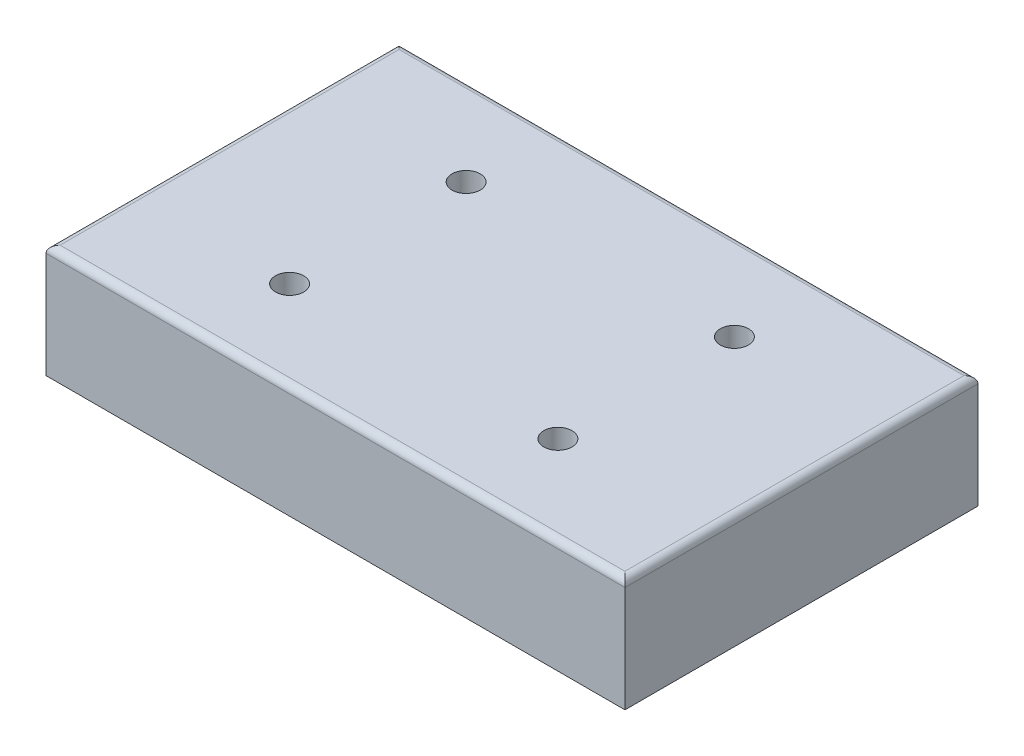
ISO-10303-21;
HEADER;
FILE_DESCRIPTION(('STEP AP214'),'2;1');
FILE_NAME('part.step','',(''),(''),'','','');
FILE_SCHEMA(('AUTOMOTIVE_DESIGN { 1 0 10303 214 1 1 1 1 }'));
ENDSEC;
DATA;
#1=APPLICATION_CONTEXT('core data for automotive mechanical design processes');
#2=APPLICATION_PROTOCOL_DEFINITION('international standard','automotive_design',2000,#1);
#3=PRODUCT_CONTEXT('',#1,'mechanical');
#4=PRODUCT('Part','Part','',(#3));
#5=PRODUCT_RELATED_PRODUCT_CATEGORY('part','',(#4));
#6=PRODUCT_DEFINITION_FORMATION('','',#4);
#7=PRODUCT_DEFINITION_CONTEXT('part definition',#1,'design');
#8=PRODUCT_DEFINITION('design','',#6,#7);
#9=PRODUCT_DEFINITION_SHAPE('','',#8);
#10=(LENGTH_UNIT() NAMED_UNIT(*) SI_UNIT(.MILLI.,.METRE.));
#11=(NAMED_UNIT(*) PLANE_ANGLE_UNIT() SI_UNIT($,.RADIAN.));
#12=(NAMED_UNIT(*) SI_UNIT($,.STERADIAN.) SOLID_ANGLE_UNIT());
#13=UNCERTAINTY_MEASURE_WITH_UNIT(LENGTH_MEASURE(1.E-05),#10,'distance_accuracy_value','');
#14=(GEOMETRIC_REPRESENTATION_CONTEXT(3) GLOBAL_UNCERTAINTY_ASSIGNED_CONTEXT((#13)) GLOBAL_UNIT_ASSIGNED_CONTEXT((#10,
#11,#12)) REPRESENTATION_CONTEXT('',''));
#15=CARTESIAN_POINT('',(0.,0.,0.));
#16=DIRECTION('',(0.,0.,1.));
#17=DIRECTION('',(1.,0.,0.));
#18=AXIS2_PLACEMENT_3D('',#15,#16,#17);
#19=CARTESIAN_POINT('',(41.,16.,-25.));
#20=DIRECTION('',(-1.,0.,0.));
#21=DIRECTION('',(0.,0.,1.));
#22=AXIS2_PLACEMENT_3D('',#19,#20,#21);
#23=PLANE('',#22);
#24=DIRECTION('',(0.,-1.,0.));
#25=VECTOR('',#24,1.);
#26=CARTESIAN_POINT('',(41.,16.,-25.));
#27=LINE('',#26,#25);
#28=CARTESIAN_POINT('',(41.,15.,-25.));
#29=VERTEX_POINT('',#28);
#30=CARTESIAN_POINT('',(41.,0.,-25.));
#31=VERTEX_POINT('',#30);
#32=EDGE_CURVE('E154',#29,#31,#27,.T.);
#33=ORIENTED_EDGE('',*,*,#32,.F.);
#34=DIRECTION('',(0.,0.,-1.));
#35=VECTOR('',#34,1.);
#36=CARTESIAN_POINT('',(41.,15.,25.));
#37=LINE('',#36,#35);
#38=CARTESIAN_POINT('',(41.,15.,25.));
#39=VERTEX_POINT('',#38);
#40=EDGE_CURVE('E168',#29,#39,#37,.F.);
#41=ORIENTED_EDGE('',*,*,#40,.T.);
#42=DIRECTION('',(0.,-1.,0.));
#43=VECTOR('',#42,1.);
#44=CARTESIAN_POINT('',(41.,16.,25.));
#45=LINE('',#44,#43);
#46=CARTESIAN_POINT('',(41.,0.,25.));
#47=VERTEX_POINT('',#46);
#48=EDGE_CURVE('E148',#39,#47,#45,.T.);
#49=ORIENTED_EDGE('',*,*,#48,.T.);
#50=DIRECTION('',(0.,0.,-1.));
#51=VECTOR('',#50,1.);
#52=CARTESIAN_POINT('',(41.,0.,-25.));
#53=LINE('',#52,#51);
#54=EDGE_CURVE('E136',#47,#31,#53,.T.);
#55=ORIENTED_EDGE('',*,*,#54,.T.);
#56=EDGE_LOOP('',(#33,#41,#49,#55));
#57=FACE_BOUND('',#56,.T.);
#58=ADVANCED_FACE('F39',(#57),#23,.F.);
#59=CARTESIAN_POINT('',(-41.,16.,-25.));
#60=DIRECTION('',(0.,0.,1.));
#61=DIRECTION('',(1.,0.,0.));
#62=AXIS2_PLACEMENT_3D('',#59,#60,#61);
#63=PLANE('',#62);
#64=DIRECTION('',(0.,-1.,0.));
#65=VECTOR('',#64,1.);
#66=CARTESIAN_POINT('',(-41.,16.,-25.));
#67=LINE('',#66,#65);
#68=CARTESIAN_POINT('',(-41.,15.,-25.));
#69=VERTEX_POINT('',#68);
#70=CARTESIAN_POINT('',(-41.,0.,-25.));
#71=VERTEX_POINT('',#70);
#72=EDGE_CURVE('E152',#69,#71,#67,.T.);
#73=ORIENTED_EDGE('',*,*,#72,.F.);
#74=DIRECTION('',(-1.,0.,0.));
#75=VECTOR('',#74,1.);
#76=CARTESIAN_POINT('',(41.,15.,-25.));
#77=LINE('',#76,#75);
#78=EDGE_CURVE('E48',#69,#29,#77,.F.);
#79=ORIENTED_EDGE('',*,*,#78,.T.);
#80=ORIENTED_EDGE('',*,*,#32,.T.);
#81=DIRECTION('',(-1.,0.,0.));
#82=VECTOR('',#81,1.);
#83=CARTESIAN_POINT('',(-41.,0.,-25.));
#84=LINE('',#83,#82);
#85=EDGE_CURVE('E139',#31,#71,#84,.T.);
#86=ORIENTED_EDGE('',*,*,#85,.T.);
#87=EDGE_LOOP('',(#73,#79,#80,#86));
#88=FACE_BOUND('',#87,.T.);
#89=ADVANCED_FACE('F217',(#88),#63,.F.);
#90=CARTESIAN_POINT('',(-41.,16.,-25.));
#91=DIRECTION('',(1.,0.,0.));
#92=DIRECTION('',(0.,0.,-1.));
#93=AXIS2_PLACEMENT_3D('',#90,#91,#92);
#94=PLANE('',#93);
#95=DIRECTION('',(0.,-1.,0.));
#96=VECTOR('',#95,1.);
#97=CARTESIAN_POINT('',(-41.,16.,25.));
#98=LINE('',#97,#96);
#99=CARTESIAN_POINT('',(-41.,15.,25.));
#100=VERTEX_POINT('',#99);
#101=CARTESIAN_POINT('',(-41.,0.,25.));
#102=VERTEX_POINT('',#101);
#103=EDGE_CURVE('E150',#100,#102,#98,.T.);
#104=ORIENTED_EDGE('',*,*,#103,.F.);
#105=DIRECTION('',(0.,0.,1.));
#106=VECTOR('',#105,1.);
#107=CARTESIAN_POINT('',(-41.,15.,-25.));
#108=LINE('',#107,#106);
#109=EDGE_CURVE('E11',#100,#69,#108,.F.);
#110=ORIENTED_EDGE('',*,*,#109,.T.);
#111=ORIENTED_EDGE('',*,*,#72,.T.);
#112=DIRECTION('',(0.,0.,1.));
#113=VECTOR('',#112,1.);
#114=CARTESIAN_POINT('',(-41.,0.,-25.));
#115=LINE('',#114,#113);
#116=EDGE_CURVE('E142',#71,#102,#115,.T.);
#117=ORIENTED_EDGE('',*,*,#116,.T.);
#118=EDGE_LOOP('',(#104,#110,#111,#117));
#119=FACE_BOUND('',#118,.T.);
#120=ADVANCED_FACE('F211',(#119),#94,.F.);
#121=CARTESIAN_POINT('',(-41.,16.,25.));
#122=DIRECTION('',(0.,0.,-1.));
#123=DIRECTION('',(-1.,0.,0.));
#124=AXIS2_PLACEMENT_3D('',#121,#122,#123);
#125=PLANE('',#124);
#126=ORIENTED_EDGE('',*,*,#48,.F.);
#127=DIRECTION('',(1.,0.,0.));
#128=VECTOR('',#127,1.);
#129=CARTESIAN_POINT('',(-41.,15.,25.));
#130=LINE('',#129,#128);
#131=EDGE_CURVE('E165',#39,#100,#130,.F.);
#132=ORIENTED_EDGE('',*,*,#131,.T.);
#133=ORIENTED_EDGE('',*,*,#103,.T.);
#134=DIRECTION('',(1.,0.,0.));
#135=VECTOR('',#134,1.);
#136=CARTESIAN_POINT('',(-41.,0.,25.));
#137=LINE('',#136,#135);
#138=EDGE_CURVE('E145',#102,#47,#137,.T.);
#139=ORIENTED_EDGE('',*,*,#138,.T.);
#140=EDGE_LOOP('',(#126,#132,#133,#139));
#141=FACE_BOUND('',#140,.T.);
#142=ADVANCED_FACE('F193',(#141),#125,.F.);
#143=CARTESIAN_POINT('',(0.,16.,0.));
#144=DIRECTION('',(0.,1.,0.));
#145=DIRECTION('',(0.,0.,1.));
#146=AXIS2_PLACEMENT_3D('',#143,#144,#145);
#147=PLANE('',#146);
#148=CARTESIAN_POINT('',(-19.,16.,-12.5));
#149=DIRECTION('',(0.,1.,0.));
#150=DIRECTION('',(0.,0.,1.));
#151=AXIS2_PLACEMENT_3D('',#148,#149,#150);
#152=CIRCLE('',#151,1.99999999999999);
#153=CARTESIAN_POINT('',(-19.,16.,-10.5));
#154=VERTEX_POINT('',#153);
#155=EDGE_CURVE('E113',#154,#154,#152,.T.);
#156=ORIENTED_EDGE('',*,*,#155,.F.);
#157=EDGE_LOOP('',(#156));
#158=FACE_BOUND('',#157,.T.);
#159=CARTESIAN_POINT('',(19.,16.,-12.5));
#160=DIRECTION('',(0.,1.,0.));
#161=DIRECTION('',(0.,0.,1.));
#162=AXIS2_PLACEMENT_3D('',#159,#160,#161);
#163=CIRCLE('',#162,1.99999999999999);
#164=CARTESIAN_POINT('',(19.,16.,-10.5));
#165=VERTEX_POINT('',#164);
#166=EDGE_CURVE('E112',#165,#165,#163,.T.);
#167=ORIENTED_EDGE('',*,*,#166,.F.);
#168=EDGE_LOOP('',(#167));
#169=FACE_BOUND('',#168,.T.);
#170=CARTESIAN_POINT('',(19.,16.,12.5));
#171=DIRECTION('',(0.,1.,0.));
#172=DIRECTION('',(0.,0.,1.));
#173=AXIS2_PLACEMENT_3D('',#170,#171,#172);
#174=CIRCLE('',#173,1.99999999999999);
#175=CARTESIAN_POINT('',(19.,16.,14.5));
#176=VERTEX_POINT('',#175);
#177=EDGE_CURVE('E123',#176,#176,#174,.T.);
#178=ORIENTED_EDGE('',*,*,#177,.F.);
#179=EDGE_LOOP('',(#178));
#180=FACE_BOUND('',#179,.T.);
#181=CARTESIAN_POINT('',(-19.,16.,12.5));
#182=DIRECTION('',(0.,1.,0.));
#183=DIRECTION('',(0.,0.,1.));
#184=AXIS2_PLACEMENT_3D('',#181,#182,#183);
#185=CIRCLE('',#184,1.99999999999999);
#186=CARTESIAN_POINT('',(-19.,16.,14.5));
#187=VERTEX_POINT('',#186);
#188=EDGE_CURVE('E129',#187,#187,#185,.T.);
#189=ORIENTED_EDGE('',*,*,#188,.F.);
#190=EDGE_LOOP('',(#189));
#191=FACE_BOUND('',#190,.T.);
#192=DIRECTION('',(0.,0.,1.));
#193=VECTOR('',#192,1.);
#194=CARTESIAN_POINT('',(-40.,16.,25.));
#195=LINE('',#194,#193);
#196=CARTESIAN_POINT('',(-40.,16.,-24.));
#197=VERTEX_POINT('',#196);
#198=CARTESIAN_POINT('',(-40.,16.,24.));
#199=VERTEX_POINT('',#198);
#200=EDGE_CURVE('E156',#197,#199,#195,.T.);
#201=ORIENTED_EDGE('',*,*,#200,.T.);
#202=DIRECTION('',(1.,0.,0.));
#203=VECTOR('',#202,1.);
#204=CARTESIAN_POINT('',(41.,16.,24.));
#205=LINE('',#204,#203);
#206=CARTESIAN_POINT('',(40.,16.,24.));
#207=VERTEX_POINT('',#206);
#208=EDGE_CURVE('E162',#199,#207,#205,.T.);
#209=ORIENTED_EDGE('',*,*,#208,.T.);
#210=DIRECTION('',(0.,0.,-1.));
#211=VECTOR('',#210,1.);
#212=CARTESIAN_POINT('',(40.,16.,-25.));
#213=LINE('',#212,#211);
#214=CARTESIAN_POINT('',(40.,16.,-24.));
#215=VERTEX_POINT('',#214);
#216=EDGE_CURVE('E160',#207,#215,#213,.T.);
#217=ORIENTED_EDGE('',*,*,#216,.T.);
#218=DIRECTION('',(-1.,0.,0.));
#219=VECTOR('',#218,1.);
#220=CARTESIAN_POINT('',(-41.,16.,-24.));
#221=LINE('',#220,#219);
#222=EDGE_CURVE('E158',#215,#197,#221,.T.);
#223=ORIENTED_EDGE('',*,*,#222,.T.);
#224=EDGE_LOOP('',(#201,#209,#217,#223));
#225=FACE_BOUND('',#224,.T.);
#226=ADVANCED_FACE('F200',(#158,#169,#180,#191,#225),#147,.T.);
#227=CARTESIAN_POINT('',(0.,0.,0.));
#228=DIRECTION('',(0.,1.,0.));
#229=DIRECTION('',(0.,0.,1.));
#230=AXIS2_PLACEMENT_3D('',#227,#228,#229);
#231=PLANE('',#230);
#232=ORIENTED_EDGE('',*,*,#54,.F.);
#233=ORIENTED_EDGE('',*,*,#138,.F.);
#234=ORIENTED_EDGE('',*,*,#116,.F.);
#235=ORIENTED_EDGE('',*,*,#85,.F.);
#236=EDGE_LOOP('',(#232,#233,#234,#235));
#237=FACE_BOUND('',#236,.T.);
#238=ADVANCED_FACE('F202',(#237),#231,.F.);
#239=CARTESIAN_POINT('',(0.,15.,-24.));
#240=DIRECTION('',(1.,0.,0.));
#241=DIRECTION('',(0.,0.,-1.));
#242=AXIS2_PLACEMENT_3D('',#239,#240,#241);
#243=CYLINDRICAL_SURFACE('',#242,1.);
#244=CARTESIAN_POINT('',(40.,15.,-24.));
#245=DIRECTION('',(0.707106781186548,0.,0.707106781186547));
#246=DIRECTION('',(0.707106781186547,0.,-0.707106781186548));
#247=AXIS2_PLACEMENT_3D('',#244,#245,#246);
#248=ELLIPSE('',#247,1.41421356237309,1.);
#249=EDGE_CURVE('E173',#29,#215,#248,.T.);
#250=ORIENTED_EDGE('',*,*,#249,.F.);
#251=ORIENTED_EDGE('',*,*,#78,.F.);
#252=CARTESIAN_POINT('',(-40.,15.,-24.));
#253=DIRECTION('',(0.707106781186547,0.,-0.707106781186548));
#254=DIRECTION('',(-0.707106781186548,0.,-0.707106781186547));
#255=AXIS2_PLACEMENT_3D('',#252,#253,#254);
#256=ELLIPSE('',#255,1.4142135623731,1.);
#257=EDGE_CURVE('E43',#197,#69,#256,.F.);
#258=ORIENTED_EDGE('',*,*,#257,.F.);
#259=ORIENTED_EDGE('',*,*,#222,.F.);
#260=EDGE_LOOP('',(#250,#251,#258,#259));
#261=FACE_BOUND('',#260,.T.);
#262=ADVANCED_FACE('F41',(#261),#243,.T.);
#263=CARTESIAN_POINT('',(-40.,15.,0.));
#264=DIRECTION('',(0.,0.,-1.));
#265=DIRECTION('',(-1.,0.,0.));
#266=AXIS2_PLACEMENT_3D('',#263,#264,#265);
#267=CYLINDRICAL_SURFACE('',#266,1.);
#268=ORIENTED_EDGE('',*,*,#257,.T.);
#269=ORIENTED_EDGE('',*,*,#109,.F.);
#270=CARTESIAN_POINT('',(-40.,15.,24.));
#271=DIRECTION('',(-0.707106781186548,0.,-0.707106781186547));
#272=DIRECTION('',(0.707106781186547,0.,-0.707106781186548));
#273=AXIS2_PLACEMENT_3D('',#270,#271,#272);
#274=ELLIPSE('',#273,1.41421356237309,1.);
#275=EDGE_CURVE('E172',#199,#100,#274,.F.);
#276=ORIENTED_EDGE('',*,*,#275,.F.);
#277=ORIENTED_EDGE('',*,*,#200,.F.);
#278=EDGE_LOOP('',(#268,#269,#276,#277));
#279=FACE_BOUND('',#278,.T.);
#280=ADVANCED_FACE('F183',(#279),#267,.T.);
#281=CARTESIAN_POINT('',(40.,15.,0.));
#282=DIRECTION('',(0.,0.,1.));
#283=DIRECTION('',(1.,0.,0.));
#284=AXIS2_PLACEMENT_3D('',#281,#282,#283);
#285=CYLINDRICAL_SURFACE('',#284,1.);
#286=ORIENTED_EDGE('',*,*,#249,.T.);
#287=ORIENTED_EDGE('',*,*,#216,.F.);
#288=CARTESIAN_POINT('',(40.,15.,24.));
#289=DIRECTION('',(-0.707106781186547,0.,0.707106781186548));
#290=DIRECTION('',(0.707106781186548,0.,0.707106781186547));
#291=AXIS2_PLACEMENT_3D('',#288,#289,#290);
#292=ELLIPSE('',#291,1.4142135623731,1.);
#293=EDGE_CURVE('E135',#39,#207,#292,.T.);
#294=ORIENTED_EDGE('',*,*,#293,.F.);
#295=ORIENTED_EDGE('',*,*,#40,.F.);
#296=EDGE_LOOP('',(#286,#287,#294,#295));
#297=FACE_BOUND('',#296,.T.);
#298=ADVANCED_FACE('F188',(#297),#285,.T.);
#299=CARTESIAN_POINT('',(0.,15.,24.));
#300=DIRECTION('',(-1.,0.,0.));
#301=DIRECTION('',(0.,0.,1.));
#302=AXIS2_PLACEMENT_3D('',#299,#300,#301);
#303=CYLINDRICAL_SURFACE('',#302,1.);
#304=ORIENTED_EDGE('',*,*,#275,.T.);
#305=ORIENTED_EDGE('',*,*,#131,.F.);
#306=ORIENTED_EDGE('',*,*,#293,.T.);
#307=ORIENTED_EDGE('',*,*,#208,.F.);
#308=EDGE_LOOP('',(#304,#305,#306,#307));
#309=FACE_BOUND('',#308,.T.);
#310=ADVANCED_FACE('F197',(#309),#303,.T.);
#311=CARTESIAN_POINT('',(-19.,9.20172123805512,12.5));
#312=DIRECTION('',(0.,1.,0.));
#313=DIRECTION('',(0.,0.,1.));
#314=AXIS2_PLACEMENT_3D('',#311,#312,#313);
#315=CONICAL_SURFACE('',#314,2.,1.02974425867665);
#316=CARTESIAN_POINT('',(-19.,8.,12.5));
#317=VERTEX_POINT('',#316);
#318=VERTEX_LOOP('',#317);
#319=FACE_BOUND('',#318,.T.);
#320=CARTESIAN_POINT('',(-19.,9.20172123805512,12.5));
#321=DIRECTION('',(0.,1.,0.));
#322=DIRECTION('',(0.,0.,1.));
#323=AXIS2_PLACEMENT_3D('',#320,#321,#322);
#324=CIRCLE('',#323,2.);
#325=CARTESIAN_POINT('',(-19.,9.20172123805512,14.5));
#326=VERTEX_POINT('',#325);
#327=EDGE_CURVE('E132',#326,#326,#324,.T.);
#328=ORIENTED_EDGE('',*,*,#327,.T.);
#329=EDGE_LOOP('',(#328));
#330=FACE_BOUND('',#329,.T.);
#331=ADVANCED_FACE('F227',(#319,#330),#315,.F.);
#332=CARTESIAN_POINT('',(-19.,16.,12.5));
#333=DIRECTION('',(0.,1.,0.));
#334=DIRECTION('',(0.,0.,1.));
#335=AXIS2_PLACEMENT_3D('',#332,#333,#334);
#336=CYLINDRICAL_SURFACE('',#335,1.99999999999999);
#337=ORIENTED_EDGE('',*,*,#327,.F.);
#338=EDGE_LOOP('',(#337));
#339=FACE_BOUND('',#338,.T.);
#340=ORIENTED_EDGE('',*,*,#188,.T.);
#341=EDGE_LOOP('',(#340));
#342=FACE_BOUND('',#341,.T.);
#343=ADVANCED_FACE('F287',(#339,#342),#336,.F.);
#344=CARTESIAN_POINT('',(19.,9.20172123805512,12.5));
#345=DIRECTION('',(0.,1.,0.));
#346=DIRECTION('',(0.,0.,1.));
#347=AXIS2_PLACEMENT_3D('',#344,#345,#346);
#348=CONICAL_SURFACE('',#347,2.,1.02974425867665);
#349=CARTESIAN_POINT('',(19.,8.,12.5));
#350=VERTEX_POINT('',#349);
#351=VERTEX_LOOP('',#350);
#352=FACE_BOUND('',#351,.T.);
#353=CARTESIAN_POINT('',(19.,9.20172123805512,12.5));
#354=DIRECTION('',(0.,1.,0.));
#355=DIRECTION('',(0.,0.,1.));
#356=AXIS2_PLACEMENT_3D('',#353,#354,#355);
#357=CIRCLE('',#356,2.);
#358=CARTESIAN_POINT('',(19.,9.20172123805512,14.5));
#359=VERTEX_POINT('',#358);
#360=EDGE_CURVE('E126',#359,#359,#357,.T.);
#361=ORIENTED_EDGE('',*,*,#360,.T.);
#362=EDGE_LOOP('',(#361));
#363=FACE_BOUND('',#362,.T.);
#364=ADVANCED_FACE('F297',(#352,#363),#348,.F.);
#365=CARTESIAN_POINT('',(19.,16.,12.5));
#366=DIRECTION('',(0.,1.,0.));
#367=DIRECTION('',(0.,0.,1.));
#368=AXIS2_PLACEMENT_3D('',#365,#366,#367);
#369=CYLINDRICAL_SURFACE('',#368,1.99999999999999);
#370=ORIENTED_EDGE('',*,*,#360,.F.);
#371=EDGE_LOOP('',(#370));
#372=FACE_BOUND('',#371,.T.);
#373=ORIENTED_EDGE('',*,*,#177,.T.);
#374=EDGE_LOOP('',(#373));
#375=FACE_BOUND('',#374,.T.);
#376=ADVANCED_FACE('F308',(#372,#375),#369,.F.);
#377=CARTESIAN_POINT('',(19.,9.20172123805512,-12.5));
#378=DIRECTION('',(0.,1.,0.));
#379=DIRECTION('',(0.,0.,1.));
#380=AXIS2_PLACEMENT_3D('',#377,#378,#379);
#381=CONICAL_SURFACE('',#380,2.,1.02974425867665);
#382=CARTESIAN_POINT('',(19.,8.,-12.5));
#383=VERTEX_POINT('',#382);
#384=VERTEX_LOOP('',#383);
#385=FACE_BOUND('',#384,.T.);
#386=CARTESIAN_POINT('',(19.,9.20172123805512,-12.5));
#387=DIRECTION('',(0.,1.,0.));
#388=DIRECTION('',(0.,0.,1.));
#389=AXIS2_PLACEMENT_3D('',#386,#387,#388);
#390=CIRCLE('',#389,2.);
#391=CARTESIAN_POINT('',(19.,9.20172123805512,-10.5));
#392=VERTEX_POINT('',#391);
#393=EDGE_CURVE('E116',#392,#392,#390,.T.);
#394=ORIENTED_EDGE('',*,*,#393,.T.);
#395=EDGE_LOOP('',(#394));
#396=FACE_BOUND('',#395,.T.);
#397=ADVANCED_FACE('F319',(#385,#396),#381,.F.);
#398=CARTESIAN_POINT('',(19.,16.,-12.5));
#399=DIRECTION('',(0.,1.,0.));
#400=DIRECTION('',(0.,0.,1.));
#401=AXIS2_PLACEMENT_3D('',#398,#399,#400);
#402=CYLINDRICAL_SURFACE('',#401,1.99999999999999);
#403=ORIENTED_EDGE('',*,*,#393,.F.);
#404=EDGE_LOOP('',(#403));
#405=FACE_BOUND('',#404,.T.);
#406=ORIENTED_EDGE('',*,*,#166,.T.);
#407=EDGE_LOOP('',(#406));
#408=FACE_BOUND('',#407,.T.);
#409=ADVANCED_FACE('F106',(#405,#408),#402,.F.);
#410=CARTESIAN_POINT('',(-19.,9.20172123805512,-12.5));
#411=DIRECTION('',(0.,1.,0.));
#412=DIRECTION('',(0.,0.,1.));
#413=AXIS2_PLACEMENT_3D('',#410,#411,#412);
#414=CONICAL_SURFACE('',#413,2.,1.02974425867665);
#415=CARTESIAN_POINT('',(-19.,8.,-12.5));
#416=VERTEX_POINT('',#415);
#417=VERTEX_LOOP('',#416);
#418=FACE_BOUND('',#417,.T.);
#419=CARTESIAN_POINT('',(-19.,9.20172123805512,-12.5));
#420=DIRECTION('',(0.,1.,0.));
#421=DIRECTION('',(0.,0.,1.));
#422=AXIS2_PLACEMENT_3D('',#419,#420,#421);
#423=CIRCLE('',#422,2.);
#424=CARTESIAN_POINT('',(-19.,9.20172123805512,-10.5));
#425=VERTEX_POINT('',#424);
#426=EDGE_CURVE('E110',#425,#425,#423,.T.);
#427=ORIENTED_EDGE('',*,*,#426,.T.);
#428=EDGE_LOOP('',(#427));
#429=FACE_BOUND('',#428,.T.);
#430=ADVANCED_FACE('F102',(#418,#429),#414,.F.);
#431=CARTESIAN_POINT('',(-19.,16.,-12.5));
#432=DIRECTION('',(0.,1.,0.));
#433=DIRECTION('',(0.,0.,1.));
#434=AXIS2_PLACEMENT_3D('',#431,#432,#433);
#435=CYLINDRICAL_SURFACE('',#434,1.99999999999999);
#436=ORIENTED_EDGE('',*,*,#426,.F.);
#437=EDGE_LOOP('',(#436));
#438=FACE_BOUND('',#437,.T.);
#439=ORIENTED_EDGE('',*,*,#155,.T.);
#440=EDGE_LOOP('',(#439));
#441=FACE_BOUND('',#440,.T.);
#442=ADVANCED_FACE('F105',(#438,#441),#435,.F.);
#443=CLOSED_SHELL('',(#58,#89,#120,#142,#226,#238,#262,#280,#298,#310,#331,#343,#364,#376,#397,
#409,#430,#442));
#444=MANIFOLD_SOLID_BREP('B2',#443);
#445=ADVANCED_BREP_SHAPE_REPRESENTATION('',(#18,#444),#14);
#446=SHAPE_DEFINITION_REPRESENTATION(#9,#445);
ENDSEC;
END-ISO-10303-21;
